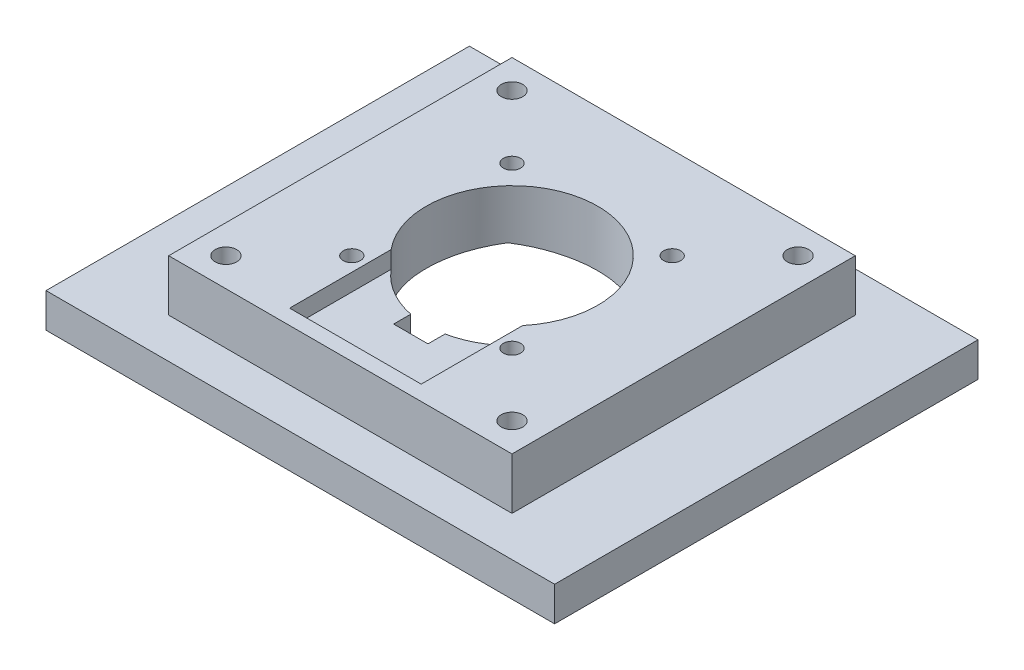
ISO-10303-21;
HEADER;
FILE_DESCRIPTION(('STEP AP214'),'2;1');
FILE_NAME('part.step','',(''),(''),'','','');
FILE_SCHEMA(('AUTOMOTIVE_DESIGN { 1 0 10303 214 1 1 1 1 }'));
ENDSEC;
DATA;
#1=APPLICATION_CONTEXT('core data for automotive mechanical design processes');
#2=APPLICATION_PROTOCOL_DEFINITION('international standard','automotive_design',2000,#1);
#3=PRODUCT_CONTEXT('',#1,'mechanical');
#4=PRODUCT('Part','Part','',(#3));
#5=PRODUCT_RELATED_PRODUCT_CATEGORY('part','',(#4));
#6=PRODUCT_DEFINITION_FORMATION('','',#4);
#7=PRODUCT_DEFINITION_CONTEXT('part definition',#1,'design');
#8=PRODUCT_DEFINITION('design','',#6,#7);
#9=PRODUCT_DEFINITION_SHAPE('','',#8);
#10=(LENGTH_UNIT() NAMED_UNIT(*) SI_UNIT(.MILLI.,.METRE.));
#11=(NAMED_UNIT(*) PLANE_ANGLE_UNIT() SI_UNIT($,.RADIAN.));
#12=(NAMED_UNIT(*) SI_UNIT($,.STERADIAN.) SOLID_ANGLE_UNIT());
#13=UNCERTAINTY_MEASURE_WITH_UNIT(LENGTH_MEASURE(1.E-05),#10,'distance_accuracy_value','');
#14=(GEOMETRIC_REPRESENTATION_CONTEXT(3) GLOBAL_UNCERTAINTY_ASSIGNED_CONTEXT((#13)) GLOBAL_UNIT_ASSIGNED_CONTEXT((#10,
#11,#12)) REPRESENTATION_CONTEXT('',''));
#15=CARTESIAN_POINT('',(0.,0.,0.));
#16=DIRECTION('',(0.,0.,1.));
#17=DIRECTION('',(1.,0.,0.));
#18=AXIS2_PLACEMENT_3D('',#15,#16,#17);
#19=CARTESIAN_POINT('',(30.,15.,30.));
#20=DIRECTION('',(-1.,0.,0.));
#21=DIRECTION('',(0.,0.,1.));
#22=AXIS2_PLACEMENT_3D('',#19,#20,#21);
#23=PLANE('',#22);
#24=DIRECTION('',(0.,-1.,0.));
#25=VECTOR('',#24,1.);
#26=CARTESIAN_POINT('',(30.,15.,30.));
#27=LINE('',#26,#25);
#28=CARTESIAN_POINT('',(30.,15.,30.));
#29=VERTEX_POINT('',#28);
#30=CARTESIAN_POINT('',(30.,6.,30.));
#31=VERTEX_POINT('',#30);
#32=EDGE_CURVE('E382',#29,#31,#27,.T.);
#33=ORIENTED_EDGE('',*,*,#32,.T.);
#34=DIRECTION('',(0.,0.,1.));
#35=VECTOR('',#34,1.);
#36=CARTESIAN_POINT('',(30.,6.,-30.));
#37=LINE('',#36,#35);
#38=CARTESIAN_POINT('',(30.,6.,-30.));
#39=VERTEX_POINT('',#38);
#40=EDGE_CURVE('E340',#39,#31,#37,.T.);
#41=ORIENTED_EDGE('',*,*,#40,.F.);
#42=DIRECTION('',(0.,-1.,0.));
#43=VECTOR('',#42,1.);
#44=CARTESIAN_POINT('',(30.,15.,-30.));
#45=LINE('',#44,#43);
#46=CARTESIAN_POINT('',(30.,15.,-30.));
#47=VERTEX_POINT('',#46);
#48=EDGE_CURVE('E394',#47,#39,#45,.T.);
#49=ORIENTED_EDGE('',*,*,#48,.F.);
#50=DIRECTION('',(0.,0.,-1.));
#51=VECTOR('',#50,1.);
#52=CARTESIAN_POINT('',(30.,15.,30.));
#53=LINE('',#52,#51);
#54=EDGE_CURVE('E368',#29,#47,#53,.T.);
#55=ORIENTED_EDGE('',*,*,#54,.F.);
#56=EDGE_LOOP('',(#33,#41,#49,#55));
#57=FACE_BOUND('',#56,.T.);
#58=ADVANCED_FACE('F47',(#57),#23,.F.);
#59=CARTESIAN_POINT('',(-30.,15.,-30.));
#60=DIRECTION('',(0.,0.,1.));
#61=DIRECTION('',(1.,0.,0.));
#62=AXIS2_PLACEMENT_3D('',#59,#60,#61);
#63=PLANE('',#62);
#64=ORIENTED_EDGE('',*,*,#48,.T.);
#65=DIRECTION('',(1.,0.,0.));
#66=VECTOR('',#65,1.);
#67=CARTESIAN_POINT('',(-30.,6.,-30.));
#68=LINE('',#67,#66);
#69=CARTESIAN_POINT('',(-30.,6.,-30.));
#70=VERTEX_POINT('',#69);
#71=EDGE_CURVE('E326',#70,#39,#68,.T.);
#72=ORIENTED_EDGE('',*,*,#71,.F.);
#73=DIRECTION('',(0.,-1.,0.));
#74=VECTOR('',#73,1.);
#75=CARTESIAN_POINT('',(-30.,15.,-30.));
#76=LINE('',#75,#74);
#77=CARTESIAN_POINT('',(-30.,15.,-30.));
#78=VERTEX_POINT('',#77);
#79=EDGE_CURVE('E390',#78,#70,#76,.T.);
#80=ORIENTED_EDGE('',*,*,#79,.F.);
#81=DIRECTION('',(-1.,0.,0.));
#82=VECTOR('',#81,1.);
#83=CARTESIAN_POINT('',(-30.,15.,-30.));
#84=LINE('',#83,#82);
#85=EDGE_CURVE('E372',#47,#78,#84,.T.);
#86=ORIENTED_EDGE('',*,*,#85,.F.);
#87=EDGE_LOOP('',(#64,#72,#80,#86));
#88=FACE_BOUND('',#87,.T.);
#89=ADVANCED_FACE('F499',(#88),#63,.F.);
#90=CARTESIAN_POINT('',(-30.,15.,30.));
#91=DIRECTION('',(1.,0.,0.));
#92=DIRECTION('',(0.,0.,-1.));
#93=AXIS2_PLACEMENT_3D('',#90,#91,#92);
#94=PLANE('',#93);
#95=ORIENTED_EDGE('',*,*,#79,.T.);
#96=DIRECTION('',(0.,0.,-1.));
#97=VECTOR('',#96,1.);
#98=CARTESIAN_POINT('',(-30.,6.,30.));
#99=LINE('',#98,#97);
#100=CARTESIAN_POINT('',(-30.,6.,30.));
#101=VERTEX_POINT('',#100);
#102=EDGE_CURVE('E346',#101,#70,#99,.T.);
#103=ORIENTED_EDGE('',*,*,#102,.F.);
#104=DIRECTION('',(0.,-1.,0.));
#105=VECTOR('',#104,1.);
#106=CARTESIAN_POINT('',(-30.,15.,30.));
#107=LINE('',#106,#105);
#108=CARTESIAN_POINT('',(-30.,15.,30.));
#109=VERTEX_POINT('',#108);
#110=EDGE_CURVE('E386',#109,#101,#107,.T.);
#111=ORIENTED_EDGE('',*,*,#110,.F.);
#112=DIRECTION('',(0.,0.,1.));
#113=VECTOR('',#112,1.);
#114=CARTESIAN_POINT('',(-30.,15.,30.));
#115=LINE('',#114,#113);
#116=EDGE_CURVE('E376',#78,#109,#115,.T.);
#117=ORIENTED_EDGE('',*,*,#116,.F.);
#118=EDGE_LOOP('',(#95,#103,#111,#117));
#119=FACE_BOUND('',#118,.T.);
#120=ADVANCED_FACE('F504',(#119),#94,.F.);
#121=CARTESIAN_POINT('',(-30.,15.,30.));
#122=DIRECTION('',(0.,0.,-1.));
#123=DIRECTION('',(-1.,0.,0.));
#124=AXIS2_PLACEMENT_3D('',#121,#122,#123);
#125=PLANE('',#124);
#126=ORIENTED_EDGE('',*,*,#110,.T.);
#127=DIRECTION('',(-1.,0.,0.));
#128=VECTOR('',#127,1.);
#129=CARTESIAN_POINT('',(30.,6.,30.));
#130=LINE('',#129,#128);
#131=EDGE_CURVE('E343',#31,#101,#130,.T.);
#132=ORIENTED_EDGE('',*,*,#131,.F.);
#133=ORIENTED_EDGE('',*,*,#32,.F.);
#134=DIRECTION('',(1.,0.,0.));
#135=VECTOR('',#134,1.);
#136=CARTESIAN_POINT('',(-30.,15.,30.));
#137=LINE('',#136,#135);
#138=EDGE_CURVE('E379',#109,#29,#137,.T.);
#139=ORIENTED_EDGE('',*,*,#138,.F.);
#140=EDGE_LOOP('',(#126,#132,#133,#139));
#141=FACE_BOUND('',#140,.T.);
#142=ADVANCED_FACE('F513',(#141),#125,.F.);
#143=CARTESIAN_POINT('',(0.,15.,0.));
#144=DIRECTION('',(0.,-1.,0.));
#145=DIRECTION('',(0.,0.,-1.));
#146=AXIS2_PLACEMENT_3D('',#143,#144,#145);
#147=PLANE('',#146);
#148=CARTESIAN_POINT('',(-25.,15.,25.));
#149=DIRECTION('',(0.,1.,0.));
#150=DIRECTION('',(0.,0.,1.));
#151=AXIS2_PLACEMENT_3D('',#148,#149,#150);
#152=CIRCLE('',#151,1.875);
#153=CARTESIAN_POINT('',(-25.,15.,26.875));
#154=VERTEX_POINT('',#153);
#155=EDGE_CURVE('E210',#154,#154,#152,.T.);
#156=ORIENTED_EDGE('',*,*,#155,.F.);
#157=EDGE_LOOP('',(#156));
#158=FACE_BOUND('',#157,.T.);
#159=CARTESIAN_POINT('',(25.,15.,25.));
#160=DIRECTION('',(0.,1.,0.));
#161=DIRECTION('',(0.,0.,1.));
#162=AXIS2_PLACEMENT_3D('',#159,#160,#161);
#163=CIRCLE('',#162,1.875);
#164=CARTESIAN_POINT('',(25.,15.,26.875));
#165=VERTEX_POINT('',#164);
#166=EDGE_CURVE('E224',#165,#165,#163,.T.);
#167=ORIENTED_EDGE('',*,*,#166,.F.);
#168=EDGE_LOOP('',(#167));
#169=FACE_BOUND('',#168,.T.);
#170=CARTESIAN_POINT('',(25.,15.,-25.));
#171=DIRECTION('',(0.,1.,0.));
#172=DIRECTION('',(0.,0.,1.));
#173=AXIS2_PLACEMENT_3D('',#170,#171,#172);
#174=CIRCLE('',#173,1.875);
#175=CARTESIAN_POINT('',(25.,15.,-23.125));
#176=VERTEX_POINT('',#175);
#177=EDGE_CURVE('E216',#176,#176,#174,.T.);
#178=ORIENTED_EDGE('',*,*,#177,.F.);
#179=EDGE_LOOP('',(#178));
#180=FACE_BOUND('',#179,.T.);
#181=CARTESIAN_POINT('',(-25.,15.,-25.));
#182=DIRECTION('',(0.,1.,0.));
#183=DIRECTION('',(0.,0.,1.));
#184=AXIS2_PLACEMENT_3D('',#181,#182,#183);
#185=CIRCLE('',#184,1.875);
#186=CARTESIAN_POINT('',(-25.,15.,-23.125));
#187=VERTEX_POINT('',#186);
#188=EDGE_CURVE('E215',#187,#187,#185,.T.);
#189=ORIENTED_EDGE('',*,*,#188,.F.);
#190=EDGE_LOOP('',(#189));
#191=FACE_BOUND('',#190,.T.);
#192=CARTESIAN_POINT('',(-14.,15.,14.));
#193=DIRECTION('',(0.,1.,0.));
#194=DIRECTION('',(0.,0.,1.));
#195=AXIS2_PLACEMENT_3D('',#192,#193,#194);
#196=CIRCLE('',#195,1.5);
#197=CARTESIAN_POINT('',(-14.,15.,15.5));
#198=VERTEX_POINT('',#197);
#199=EDGE_CURVE('E273',#198,#198,#196,.T.);
#200=ORIENTED_EDGE('',*,*,#199,.F.);
#201=EDGE_LOOP('',(#200));
#202=FACE_BOUND('',#201,.T.);
#203=CARTESIAN_POINT('',(14.,15.,14.));
#204=DIRECTION('',(0.,1.,0.));
#205=DIRECTION('',(0.,0.,1.));
#206=AXIS2_PLACEMENT_3D('',#203,#204,#205);
#207=CIRCLE('',#206,1.5);
#208=CARTESIAN_POINT('',(14.,15.,15.5));
#209=VERTEX_POINT('',#208);
#210=EDGE_CURVE('E290',#209,#209,#207,.T.);
#211=ORIENTED_EDGE('',*,*,#210,.F.);
#212=EDGE_LOOP('',(#211));
#213=FACE_BOUND('',#212,.T.);
#214=CARTESIAN_POINT('',(14.,15.,-14.));
#215=DIRECTION('',(0.,1.,0.));
#216=DIRECTION('',(0.,0.,1.));
#217=AXIS2_PLACEMENT_3D('',#214,#215,#216);
#218=CIRCLE('',#217,1.5);
#219=CARTESIAN_POINT('',(14.,15.,-12.5));
#220=VERTEX_POINT('',#219);
#221=EDGE_CURVE('E282',#220,#220,#218,.T.);
#222=ORIENTED_EDGE('',*,*,#221,.F.);
#223=EDGE_LOOP('',(#222));
#224=FACE_BOUND('',#223,.T.);
#225=CARTESIAN_POINT('',(-14.,15.,-14.));
#226=DIRECTION('',(0.,1.,0.));
#227=DIRECTION('',(0.,0.,1.));
#228=AXIS2_PLACEMENT_3D('',#225,#226,#227);
#229=CIRCLE('',#228,1.5);
#230=CARTESIAN_POINT('',(-14.,15.,-12.5));
#231=VERTEX_POINT('',#230);
#232=EDGE_CURVE('E281',#231,#231,#229,.T.);
#233=ORIENTED_EDGE('',*,*,#232,.F.);
#234=EDGE_LOOP('',(#233));
#235=FACE_BOUND('',#234,.T.);
#236=DIRECTION('',(1.,0.,0.));
#237=VECTOR('',#236,1.);
#238=CARTESIAN_POINT('',(-11.5,15.,27.3693198578709));
#239=LINE('',#238,#237);
#240=CARTESIAN_POINT('',(-11.5,15.,27.3693198578709));
#241=VERTEX_POINT('',#240);
#242=CARTESIAN_POINT('',(11.5,15.,27.3693198578709));
#243=VERTEX_POINT('',#242);
#244=EDGE_CURVE('E239',#241,#243,#239,.T.);
#245=ORIENTED_EDGE('',*,*,#244,.F.);
#246=DIRECTION('',(0.,0.,1.));
#247=VECTOR('',#246,1.);
#248=CARTESIAN_POINT('',(-11.5,15.,9.63068014212911));
#249=LINE('',#248,#247);
#250=CARTESIAN_POINT('',(-11.5,15.,9.63068014212911));
#251=VERTEX_POINT('',#250);
#252=EDGE_CURVE('E262',#251,#241,#249,.T.);
#253=ORIENTED_EDGE('',*,*,#252,.F.);
#254=CARTESIAN_POINT('',(0.,15.,0.));
#255=DIRECTION('',(0.,1.,0.));
#256=DIRECTION('',(0.,0.,1.));
#257=AXIS2_PLACEMENT_3D('',#254,#255,#256);
#258=CIRCLE('',#257,15.);
#259=CARTESIAN_POINT('',(11.5,15.,9.63068014212911));
#260=VERTEX_POINT('',#259);
#261=EDGE_CURVE('E305',#260,#251,#258,.T.);
#262=ORIENTED_EDGE('',*,*,#261,.F.);
#263=DIRECTION('',(0.,0.,-1.));
#264=VECTOR('',#263,1.);
#265=CARTESIAN_POINT('',(11.5,15.,9.63068014212911));
#266=LINE('',#265,#264);
#267=EDGE_CURVE('E258',#243,#260,#266,.T.);
#268=ORIENTED_EDGE('',*,*,#267,.F.);
#269=EDGE_LOOP('',(#245,#253,#262,#268));
#270=FACE_BOUND('',#269,.T.);
#271=ORIENTED_EDGE('',*,*,#54,.T.);
#272=ORIENTED_EDGE('',*,*,#85,.T.);
#273=ORIENTED_EDGE('',*,*,#116,.T.);
#274=ORIENTED_EDGE('',*,*,#138,.T.);
#275=EDGE_LOOP('',(#271,#272,#273,#274));
#276=FACE_BOUND('',#275,.T.);
#277=ADVANCED_FACE('F443',(#158,#169,#180,#191,#202,#213,#224,#235,#270,#276),#147,.F.);
#278=CARTESIAN_POINT('',(-44.4461231261567,6.,37.));
#279=DIRECTION('',(-1.,0.,0.));
#280=DIRECTION('',(0.,0.,1.));
#281=AXIS2_PLACEMENT_3D('',#278,#279,#280);
#282=PLANE('',#281);
#283=DIRECTION('',(0.,0.,1.));
#284=VECTOR('',#283,1.);
#285=CARTESIAN_POINT('',(-44.4461231261567,0.,0.));
#286=LINE('',#285,#284);
#287=CARTESIAN_POINT('',(-44.4461231261567,0.,37.));
#288=VERTEX_POINT('',#287);
#289=CARTESIAN_POINT('',(-44.4461231261567,0.,-37.));
#290=VERTEX_POINT('',#289);
#291=EDGE_CURVE('E349',#288,#290,#286,.F.);
#292=ORIENTED_EDGE('',*,*,#291,.F.);
#293=DIRECTION('',(0.,-1.,0.));
#294=VECTOR('',#293,1.);
#295=CARTESIAN_POINT('',(-44.4461231261567,6.,37.));
#296=LINE('',#295,#294);
#297=CARTESIAN_POINT('',(-44.4461231261567,6.,37.));
#298=VERTEX_POINT('',#297);
#299=EDGE_CURVE('E373',#298,#288,#296,.T.);
#300=ORIENTED_EDGE('',*,*,#299,.F.);
#301=DIRECTION('',(0.,0.,-1.));
#302=VECTOR('',#301,1.);
#303=CARTESIAN_POINT('',(-44.4461231261567,6.,37.));
#304=LINE('',#303,#302);
#305=CARTESIAN_POINT('',(-44.4461231261567,6.,-37.));
#306=VERTEX_POINT('',#305);
#307=EDGE_CURVE('E350',#298,#306,#304,.T.);
#308=ORIENTED_EDGE('',*,*,#307,.T.);
#309=DIRECTION('',(0.,-1.,0.));
#310=VECTOR('',#309,1.);
#311=CARTESIAN_POINT('',(-44.4461231261567,6.,-37.));
#312=LINE('',#311,#310);
#313=EDGE_CURVE('E367',#306,#290,#312,.T.);
#314=ORIENTED_EDGE('',*,*,#313,.T.);
#315=EDGE_LOOP('',(#292,#300,#308,#314));
#316=FACE_BOUND('',#315,.T.);
#317=ADVANCED_FACE('F471',(#316),#282,.T.);
#318=CARTESIAN_POINT('',(44.4461231261567,6.,37.));
#319=DIRECTION('',(0.,0.,1.));
#320=DIRECTION('',(1.,0.,0.));
#321=AXIS2_PLACEMENT_3D('',#318,#319,#320);
#322=PLANE('',#321);
#323=DIRECTION('',(1.,0.,0.));
#324=VECTOR('',#323,1.);
#325=CARTESIAN_POINT('',(0.,0.,37.));
#326=LINE('',#325,#324);
#327=CARTESIAN_POINT('',(44.4461231261567,0.,37.));
#328=VERTEX_POINT('',#327);
#329=EDGE_CURVE('E355',#328,#288,#326,.F.);
#330=ORIENTED_EDGE('',*,*,#329,.F.);
#331=DIRECTION('',(0.,-1.,0.));
#332=VECTOR('',#331,1.);
#333=CARTESIAN_POINT('',(44.4461231261567,6.,37.));
#334=LINE('',#333,#332);
#335=CARTESIAN_POINT('',(44.4461231261567,6.,37.));
#336=VERTEX_POINT('',#335);
#337=EDGE_CURVE('E399',#336,#328,#334,.T.);
#338=ORIENTED_EDGE('',*,*,#337,.F.);
#339=DIRECTION('',(-1.,0.,0.));
#340=VECTOR('',#339,1.);
#341=CARTESIAN_POINT('',(44.4461231261567,6.,37.));
#342=LINE('',#341,#340);
#343=EDGE_CURVE('E363',#336,#298,#342,.T.);
#344=ORIENTED_EDGE('',*,*,#343,.T.);
#345=ORIENTED_EDGE('',*,*,#299,.T.);
#346=EDGE_LOOP('',(#330,#338,#344,#345));
#347=FACE_BOUND('',#346,.T.);
#348=ADVANCED_FACE('F466',(#347),#322,.T.);
#349=CARTESIAN_POINT('',(44.4461231261567,6.,37.));
#350=DIRECTION('',(1.,0.,0.));
#351=DIRECTION('',(0.,0.,-1.));
#352=AXIS2_PLACEMENT_3D('',#349,#350,#351);
#353=PLANE('',#352);
#354=DIRECTION('',(0.,0.,1.));
#355=VECTOR('',#354,1.);
#356=CARTESIAN_POINT('',(44.4461231261567,0.,0.));
#357=LINE('',#356,#355);
#358=CARTESIAN_POINT('',(44.4461231261567,0.,-37.));
#359=VERTEX_POINT('',#358);
#360=EDGE_CURVE('E415',#359,#328,#357,.T.);
#361=ORIENTED_EDGE('',*,*,#360,.F.);
#362=DIRECTION('',(0.,-1.,0.));
#363=VECTOR('',#362,1.);
#364=CARTESIAN_POINT('',(44.4461231261567,6.,-37.));
#365=LINE('',#364,#363);
#366=CARTESIAN_POINT('',(44.4461231261567,6.,-37.));
#367=VERTEX_POINT('',#366);
#368=EDGE_CURVE('E403',#367,#359,#365,.T.);
#369=ORIENTED_EDGE('',*,*,#368,.F.);
#370=DIRECTION('',(0.,0.,1.));
#371=VECTOR('',#370,1.);
#372=CARTESIAN_POINT('',(44.4461231261567,6.,37.));
#373=LINE('',#372,#371);
#374=EDGE_CURVE('E359',#367,#336,#373,.T.);
#375=ORIENTED_EDGE('',*,*,#374,.T.);
#376=ORIENTED_EDGE('',*,*,#337,.T.);
#377=EDGE_LOOP('',(#361,#369,#375,#376));
#378=FACE_BOUND('',#377,.T.);
#379=ADVANCED_FACE('F483',(#378),#353,.T.);
#380=CARTESIAN_POINT('',(44.4461231261567,6.,-37.));
#381=DIRECTION('',(0.,0.,-1.));
#382=DIRECTION('',(-1.,0.,0.));
#383=AXIS2_PLACEMENT_3D('',#380,#381,#382);
#384=PLANE('',#383);
#385=DIRECTION('',(1.,0.,0.));
#386=VECTOR('',#385,1.);
#387=CARTESIAN_POINT('',(0.,0.,-37.));
#388=LINE('',#387,#386);
#389=EDGE_CURVE('E419',#290,#359,#388,.T.);
#390=ORIENTED_EDGE('',*,*,#389,.F.);
#391=ORIENTED_EDGE('',*,*,#313,.F.);
#392=DIRECTION('',(1.,0.,0.));
#393=VECTOR('',#392,1.);
#394=CARTESIAN_POINT('',(44.4461231261567,6.,-37.));
#395=LINE('',#394,#393);
#396=EDGE_CURVE('E354',#306,#367,#395,.T.);
#397=ORIENTED_EDGE('',*,*,#396,.T.);
#398=ORIENTED_EDGE('',*,*,#368,.T.);
#399=EDGE_LOOP('',(#390,#391,#397,#398));
#400=FACE_BOUND('',#399,.T.);
#401=ADVANCED_FACE('F475',(#400),#384,.T.);
#402=CARTESIAN_POINT('',(0.,6.,0.));
#403=DIRECTION('',(0.,1.,0.));
#404=DIRECTION('',(0.,0.,1.));
#405=AXIS2_PLACEMENT_3D('',#402,#403,#404);
#406=PLANE('',#405);
#407=ORIENTED_EDGE('',*,*,#71,.T.);
#408=ORIENTED_EDGE('',*,*,#40,.T.);
#409=ORIENTED_EDGE('',*,*,#131,.T.);
#410=ORIENTED_EDGE('',*,*,#102,.T.);
#411=EDGE_LOOP('',(#407,#408,#409,#410));
#412=FACE_BOUND('',#411,.T.);
#413=ORIENTED_EDGE('',*,*,#307,.F.);
#414=ORIENTED_EDGE('',*,*,#343,.F.);
#415=ORIENTED_EDGE('',*,*,#374,.F.);
#416=ORIENTED_EDGE('',*,*,#396,.F.);
#417=EDGE_LOOP('',(#413,#414,#415,#416));
#418=FACE_BOUND('',#417,.T.);
#419=ADVANCED_FACE('F486',(#412,#418),#406,.T.);
#420=CARTESIAN_POINT('',(0.,8.31166711993473,-1.97225999456078));
#421=DIRECTION('',(0.,-0.972982875400529,0.230877292467922));
#422=DIRECTION('',(0.,-0.230877292467922,-0.972982875400529));
#423=AXIS2_PLACEMENT_3D('',#420,#421,#422);
#424=PLANE('',#423);
#425=CARTESIAN_POINT('',(0.,8.77966101694915,0.));
#426=DIRECTION('',(0.,-0.972982875400529,0.230877292467922));
#427=DIRECTION('',(0.,0.230877292467922,0.972982875400529));
#428=AXIS2_PLACEMENT_3D('',#425,#426,#427);
#429=ELLIPSE('',#428,15.4165097652158,15.);
#430=CARTESIAN_POINT('',(-10.948403517567,6.34664796789249,-10.2534121353102));
#431=VERTEX_POINT('',#430);
#432=CARTESIAN_POINT('',(10.948403517567,6.34664796789249,-10.2534121353102));
#433=VERTEX_POINT('',#432);
#434=EDGE_CURVE('E318',#431,#433,#429,.T.);
#435=ORIENTED_EDGE('',*,*,#434,.F.);
#436=DIRECTION('',(0.773028550413823,0.146461912510268,0.617232345578987));
#437=VECTOR('',#436,1.);
#438=CARTESIAN_POINT('',(-44.4461231261567,0.,-37.));
#439=LINE('',#438,#437);
#440=EDGE_CURVE('E321',#290,#431,#439,.T.);
#441=ORIENTED_EDGE('',*,*,#440,.F.);
#442=ORIENTED_EDGE('',*,*,#389,.T.);
#443=DIRECTION('',(-0.773028550413823,0.146461912510268,0.617232345578987));
#444=VECTOR('',#443,1.);
#445=CARTESIAN_POINT('',(44.4461231261567,0.,-37.));
#446=LINE('',#445,#444);
#447=EDGE_CURVE('E331',#359,#433,#446,.T.);
#448=ORIENTED_EDGE('',*,*,#447,.T.);
#449=EDGE_LOOP('',(#435,#441,#442,#448));
#450=FACE_BOUND('',#449,.T.);
#451=ADVANCED_FACE('F478',(#450),#424,.T.);
#452=CARTESIAN_POINT('',(1.54019474428657,8.12917495152444,0.));
#453=DIRECTION('',(-0.186153358519673,-0.982520700602204,0.));
#454=DIRECTION('',(0.982520700602204,-0.186153358519673,0.));
#455=AXIS2_PLACEMENT_3D('',#452,#453,#454);
#456=PLANE('',#455);
#457=CARTESIAN_POINT('',(0.,8.42098806472151,0.));
#458=DIRECTION('',(-0.186153358519673,-0.982520700602204,0.));
#459=DIRECTION('',(-0.982520700602204,0.186153358519673,0.));
#460=AXIS2_PLACEMENT_3D('',#457,#458,#459);
#461=ELLIPSE('',#460,15.2668539103616,15.);
#462=CARTESIAN_POINT('',(10.948403517567,6.34664796789249,10.2534121353102));
#463=VERTEX_POINT('',#462);
#464=EDGE_CURVE('E315',#433,#463,#461,.T.);
#465=ORIENTED_EDGE('',*,*,#464,.F.);
#466=ORIENTED_EDGE('',*,*,#447,.F.);
#467=ORIENTED_EDGE('',*,*,#360,.T.);
#468=DIRECTION('',(-0.773028550413823,0.146461912510268,-0.617232345578987));
#469=VECTOR('',#468,1.);
#470=CARTESIAN_POINT('',(44.4461231261567,0.,37.));
#471=LINE('',#470,#469);
#472=EDGE_CURVE('E322',#328,#463,#471,.T.);
#473=ORIENTED_EDGE('',*,*,#472,.T.);
#474=EDGE_LOOP('',(#465,#466,#467,#473));
#475=FACE_BOUND('',#474,.T.);
#476=ADVANCED_FACE('F481',(#475),#456,.T.);
#477=CARTESIAN_POINT('',(-1.54019474428657,8.12917495152444,0.));
#478=DIRECTION('',(0.186153358519673,-0.982520700602204,0.));
#479=DIRECTION('',(0.982520700602204,0.186153358519673,0.));
#480=AXIS2_PLACEMENT_3D('',#477,#478,#479);
#481=PLANE('',#480);
#482=CARTESIAN_POINT('',(0.,8.4209880647215,0.));
#483=DIRECTION('',(0.186153358519673,-0.982520700602204,0.));
#484=DIRECTION('',(0.982520700602204,0.186153358519673,0.));
#485=AXIS2_PLACEMENT_3D('',#482,#483,#484);
#486=ELLIPSE('',#485,15.2668539103616,15.);
#487=CARTESIAN_POINT('',(-10.948403517567,6.34664796789249,10.2534121353102));
#488=VERTEX_POINT('',#487);
#489=EDGE_CURVE('E312',#488,#431,#486,.T.);
#490=ORIENTED_EDGE('',*,*,#489,.F.);
#491=DIRECTION('',(0.773028550413823,0.146461912510268,-0.617232345578987));
#492=VECTOR('',#491,1.);
#493=CARTESIAN_POINT('',(-44.4461231261567,0.,37.));
#494=LINE('',#493,#492);
#495=EDGE_CURVE('E327',#288,#488,#494,.T.);
#496=ORIENTED_EDGE('',*,*,#495,.F.);
#497=ORIENTED_EDGE('',*,*,#291,.T.);
#498=ORIENTED_EDGE('',*,*,#440,.T.);
#499=EDGE_LOOP('',(#490,#496,#497,#498));
#500=FACE_BOUND('',#499,.T.);
#501=ADVANCED_FACE('F463',(#500),#481,.T.);
#502=CARTESIAN_POINT('',(0.,8.31166711993473,1.97225999456078));
#503=DIRECTION('',(0.,-0.972982875400529,-0.230877292467922));
#504=DIRECTION('',(0.,0.230877292467922,-0.972982875400529));
#505=AXIS2_PLACEMENT_3D('',#502,#503,#504);
#506=PLANE('',#505);
#507=DIRECTION('',(0.,-0.230877292467922,0.972982875400529));
#508=VECTOR('',#507,1.);
#509=CARTESIAN_POINT('',(3.,8.31166711993473,1.97225999456078));
#510=LINE('',#509,#508);
#511=CARTESIAN_POINT('',(3.,5.29225189163073,14.6969384566991));
#512=VERTEX_POINT('',#511);
#513=CARTESIAN_POINT('',(3.,4.58330103381193,17.6846599289354));
#514=VERTEX_POINT('',#513);
#515=EDGE_CURVE('E207',#512,#514,#510,.T.);
#516=ORIENTED_EDGE('',*,*,#515,.F.);
#517=CARTESIAN_POINT('',(0.,8.77966101694915,0.));
#518=DIRECTION('',(0.,-0.972982875400529,-0.230877292467922));
#519=DIRECTION('',(0.,0.230877292467922,-0.972982875400529));
#520=AXIS2_PLACEMENT_3D('',#517,#518,#519);
#521=ELLIPSE('',#520,15.4165097652158,15.);
#522=EDGE_CURVE('E425',#463,#512,#521,.T.);
#523=ORIENTED_EDGE('',*,*,#522,.F.);
#524=ORIENTED_EDGE('',*,*,#472,.F.);
#525=ORIENTED_EDGE('',*,*,#329,.T.);
#526=ORIENTED_EDGE('',*,*,#495,.T.);
#527=CARTESIAN_POINT('',(-3.,5.29225189163073,14.6969384566991));
#528=VERTEX_POINT('',#527);
#529=EDGE_CURVE('E398',#528,#488,#521,.T.);
#530=ORIENTED_EDGE('',*,*,#529,.F.);
#531=DIRECTION('',(0.,0.230877292467922,-0.972982875400529));
#532=VECTOR('',#531,1.);
#533=CARTESIAN_POINT('',(-3.,8.31166711993473,1.97225999456078));
#534=LINE('',#533,#532);
#535=CARTESIAN_POINT('',(-3.,4.58330103381193,17.6846599289354));
#536=VERTEX_POINT('',#535);
#537=EDGE_CURVE('E198',#536,#528,#534,.T.);
#538=ORIENTED_EDGE('',*,*,#537,.F.);
#539=DIRECTION('',(-1.,0.,0.));
#540=VECTOR('',#539,1.);
#541=CARTESIAN_POINT('',(0.,4.58330103381193,17.6846599289354));
#542=LINE('',#541,#540);
#543=EDGE_CURVE('E180',#514,#536,#542,.T.);
#544=ORIENTED_EDGE('',*,*,#543,.F.);
#545=EDGE_LOOP('',(#516,#523,#524,#525,#526,#530,#538,#544));
#546=FACE_BOUND('',#545,.T.);
#547=ADVANCED_FACE('F455',(#546),#506,.T.);
#548=CARTESIAN_POINT('',(0.,0.,0.));
#549=DIRECTION('',(0.,1.,0.));
#550=DIRECTION('',(0.,0.,1.));
#551=AXIS2_PLACEMENT_3D('',#548,#549,#550);
#552=CYLINDRICAL_SURFACE('',#551,15.);
#553=ORIENTED_EDGE('',*,*,#522,.T.);
#554=DIRECTION('',(0.,1.,0.));
#555=VECTOR('',#554,1.);
#556=CARTESIAN_POINT('',(3.,0.,14.6969384566991));
#557=LINE('',#556,#555);
#558=CARTESIAN_POINT('',(3.,12.,14.6969384566991));
#559=VERTEX_POINT('',#558);
#560=EDGE_CURVE('E203',#512,#559,#557,.T.);
#561=ORIENTED_EDGE('',*,*,#560,.T.);
#562=CARTESIAN_POINT('',(0.,12.,0.));
#563=DIRECTION('',(0.,1.,0.));
#564=DIRECTION('',(0.,0.,1.));
#565=AXIS2_PLACEMENT_3D('',#562,#563,#564);
#566=CIRCLE('',#565,15.);
#567=CARTESIAN_POINT('',(11.5,12.,9.63068014212911));
#568=VERTEX_POINT('',#567);
#569=EDGE_CURVE('E55',#568,#559,#566,.F.);
#570=ORIENTED_EDGE('',*,*,#569,.F.);
#571=DIRECTION('',(0.,1.,0.));
#572=VECTOR('',#571,1.);
#573=CARTESIAN_POINT('',(11.5,12.,9.63068014212911));
#574=LINE('',#573,#572);
#575=EDGE_CURVE('E265',#568,#260,#574,.T.);
#576=ORIENTED_EDGE('',*,*,#575,.T.);
#577=ORIENTED_EDGE('',*,*,#261,.T.);
#578=DIRECTION('',(0.,1.,0.));
#579=VECTOR('',#578,1.);
#580=CARTESIAN_POINT('',(-11.5,12.,9.63068014212911));
#581=LINE('',#580,#579);
#582=CARTESIAN_POINT('',(-11.5,12.,9.63068014212911));
#583=VERTEX_POINT('',#582);
#584=EDGE_CURVE('E270',#583,#251,#581,.T.);
#585=ORIENTED_EDGE('',*,*,#584,.F.);
#586=CARTESIAN_POINT('',(-3.,12.,14.6969384566991));
#587=VERTEX_POINT('',#586);
#588=EDGE_CURVE('E428',#587,#583,#566,.F.);
#589=ORIENTED_EDGE('',*,*,#588,.F.);
#590=DIRECTION('',(0.,1.,0.));
#591=VECTOR('',#590,1.);
#592=CARTESIAN_POINT('',(-3.,0.,14.6969384566991));
#593=LINE('',#592,#591);
#594=EDGE_CURVE('E61',#587,#528,#593,.F.);
#595=ORIENTED_EDGE('',*,*,#594,.T.);
#596=ORIENTED_EDGE('',*,*,#529,.T.);
#597=ORIENTED_EDGE('',*,*,#489,.T.);
#598=ORIENTED_EDGE('',*,*,#434,.T.);
#599=ORIENTED_EDGE('',*,*,#464,.T.);
#600=EDGE_LOOP('',(#553,#561,#570,#576,#577,#585,#589,#595,#596,#597,#598,#599));
#601=FACE_BOUND('',#600,.T.);
#602=ADVANCED_FACE('F439',(#601),#552,.F.);
#603=CARTESIAN_POINT('',(-14.,9.,-14.));
#604=DIRECTION('',(0.,1.,0.));
#605=DIRECTION('',(0.,0.,1.));
#606=AXIS2_PLACEMENT_3D('',#603,#604,#605);
#607=CYLINDRICAL_SURFACE('',#606,1.5);
#608=CARTESIAN_POINT('',(-14.,9.,-14.));
#609=DIRECTION('',(0.,1.,0.));
#610=DIRECTION('',(0.,0.,1.));
#611=AXIS2_PLACEMENT_3D('',#608,#609,#610);
#612=CIRCLE('',#611,1.5);
#613=CARTESIAN_POINT('',(-14.,9.,-12.5));
#614=VERTEX_POINT('',#613);
#615=EDGE_CURVE('E301',#614,#614,#612,.T.);
#616=ORIENTED_EDGE('',*,*,#615,.F.);
#617=EDGE_LOOP('',(#616));
#618=FACE_BOUND('',#617,.T.);
#619=ORIENTED_EDGE('',*,*,#232,.T.);
#620=EDGE_LOOP('',(#619));
#621=FACE_BOUND('',#620,.T.);
#622=ADVANCED_FACE('F602',(#618,#621),#607,.F.);
#623=CARTESIAN_POINT('',(-14.,9.,-14.));
#624=DIRECTION('',(0.,1.,0.));
#625=DIRECTION('',(0.,0.,1.));
#626=AXIS2_PLACEMENT_3D('',#623,#624,#625);
#627=PLANE('',#626);
#628=ORIENTED_EDGE('',*,*,#615,.T.);
#629=EDGE_LOOP('',(#628));
#630=FACE_BOUND('',#629,.T.);
#631=ADVANCED_FACE('F607',(#630),#627,.T.);
#632=CARTESIAN_POINT('',(14.,9.,-14.));
#633=DIRECTION('',(0.,1.,0.));
#634=DIRECTION('',(0.,0.,1.));
#635=AXIS2_PLACEMENT_3D('',#632,#633,#634);
#636=CYLINDRICAL_SURFACE('',#635,1.5);
#637=CARTESIAN_POINT('',(14.,9.,-14.));
#638=DIRECTION('',(0.,1.,0.));
#639=DIRECTION('',(0.,0.,1.));
#640=AXIS2_PLACEMENT_3D('',#637,#638,#639);
#641=CIRCLE('',#640,1.5);
#642=CARTESIAN_POINT('',(14.,9.,-12.5));
#643=VERTEX_POINT('',#642);
#644=EDGE_CURVE('E277',#643,#643,#641,.T.);
#645=ORIENTED_EDGE('',*,*,#644,.F.);
#646=EDGE_LOOP('',(#645));
#647=FACE_BOUND('',#646,.T.);
#648=ORIENTED_EDGE('',*,*,#221,.T.);
#649=EDGE_LOOP('',(#648));
#650=FACE_BOUND('',#649,.T.);
#651=ADVANCED_FACE('F619',(#647,#650),#636,.F.);
#652=CARTESIAN_POINT('',(14.,9.,-14.));
#653=DIRECTION('',(0.,1.,0.));
#654=DIRECTION('',(0.,0.,1.));
#655=AXIS2_PLACEMENT_3D('',#652,#653,#654);
#656=PLANE('',#655);
#657=ORIENTED_EDGE('',*,*,#644,.T.);
#658=EDGE_LOOP('',(#657));
#659=FACE_BOUND('',#658,.T.);
#660=ADVANCED_FACE('F629',(#659),#656,.T.);
#661=CARTESIAN_POINT('',(14.,9.,14.));
#662=DIRECTION('',(0.,1.,0.));
#663=DIRECTION('',(0.,0.,1.));
#664=AXIS2_PLACEMENT_3D('',#661,#662,#663);
#665=CYLINDRICAL_SURFACE('',#664,1.5);
#666=CARTESIAN_POINT('',(14.,9.,14.));
#667=DIRECTION('',(0.,1.,0.));
#668=DIRECTION('',(0.,0.,1.));
#669=AXIS2_PLACEMENT_3D('',#666,#667,#668);
#670=CIRCLE('',#669,1.5);
#671=CARTESIAN_POINT('',(14.,9.,15.5));
#672=VERTEX_POINT('',#671);
#673=EDGE_CURVE('E286',#672,#672,#670,.T.);
#674=ORIENTED_EDGE('',*,*,#673,.F.);
#675=EDGE_LOOP('',(#674));
#676=FACE_BOUND('',#675,.T.);
#677=ORIENTED_EDGE('',*,*,#210,.T.);
#678=EDGE_LOOP('',(#677));
#679=FACE_BOUND('',#678,.T.);
#680=ADVANCED_FACE('F639',(#676,#679),#665,.F.);
#681=CARTESIAN_POINT('',(14.,9.,14.));
#682=DIRECTION('',(0.,1.,0.));
#683=DIRECTION('',(0.,0.,1.));
#684=AXIS2_PLACEMENT_3D('',#681,#682,#683);
#685=PLANE('',#684);
#686=ORIENTED_EDGE('',*,*,#673,.T.);
#687=EDGE_LOOP('',(#686));
#688=FACE_BOUND('',#687,.T.);
#689=ADVANCED_FACE('F649',(#688),#685,.T.);
#690=CARTESIAN_POINT('',(-14.,9.,14.));
#691=DIRECTION('',(0.,1.,0.));
#692=DIRECTION('',(0.,0.,1.));
#693=AXIS2_PLACEMENT_3D('',#690,#691,#692);
#694=CYLINDRICAL_SURFACE('',#693,1.5);
#695=CARTESIAN_POINT('',(-14.,9.,14.));
#696=DIRECTION('',(0.,1.,0.));
#697=DIRECTION('',(0.,0.,1.));
#698=AXIS2_PLACEMENT_3D('',#695,#696,#697);
#699=CIRCLE('',#698,1.5);
#700=CARTESIAN_POINT('',(-14.,9.,15.5));
#701=VERTEX_POINT('',#700);
#702=EDGE_CURVE('E294',#701,#701,#699,.T.);
#703=ORIENTED_EDGE('',*,*,#702,.F.);
#704=EDGE_LOOP('',(#703));
#705=FACE_BOUND('',#704,.T.);
#706=ORIENTED_EDGE('',*,*,#199,.T.);
#707=EDGE_LOOP('',(#706));
#708=FACE_BOUND('',#707,.T.);
#709=ADVANCED_FACE('F659',(#705,#708),#694,.F.);
#710=CARTESIAN_POINT('',(-14.,9.,14.));
#711=DIRECTION('',(0.,1.,0.));
#712=DIRECTION('',(0.,0.,1.));
#713=AXIS2_PLACEMENT_3D('',#710,#711,#712);
#714=PLANE('',#713);
#715=ORIENTED_EDGE('',*,*,#702,.T.);
#716=EDGE_LOOP('',(#715));
#717=FACE_BOUND('',#716,.T.);
#718=ADVANCED_FACE('F669',(#717),#714,.T.);
#719=CARTESIAN_POINT('',(0.,12.,0.));
#720=DIRECTION('',(0.,1.,0.));
#721=DIRECTION('',(0.,0.,1.));
#722=AXIS2_PLACEMENT_3D('',#719,#720,#721);
#723=PLANE('',#722);
#724=DIRECTION('',(0.,0.,-1.));
#725=VECTOR('',#724,1.);
#726=CARTESIAN_POINT('',(3.,12.,17.6846599289354));
#727=LINE('',#726,#725);
#728=CARTESIAN_POINT('',(3.,12.,17.6846599289354));
#729=VERTEX_POINT('',#728);
#730=EDGE_CURVE('E188',#729,#559,#727,.T.);
#731=ORIENTED_EDGE('',*,*,#730,.F.);
#732=DIRECTION('',(1.,0.,0.));
#733=VECTOR('',#732,1.);
#734=CARTESIAN_POINT('',(-3.,12.,17.6846599289354));
#735=LINE('',#734,#733);
#736=CARTESIAN_POINT('',(-3.,12.,17.6846599289354));
#737=VERTEX_POINT('',#736);
#738=EDGE_CURVE('E177',#737,#729,#735,.T.);
#739=ORIENTED_EDGE('',*,*,#738,.F.);
#740=DIRECTION('',(0.,0.,1.));
#741=VECTOR('',#740,1.);
#742=CARTESIAN_POINT('',(-3.,12.,0.));
#743=LINE('',#742,#741);
#744=EDGE_CURVE('E12',#587,#737,#743,.T.);
#745=ORIENTED_EDGE('',*,*,#744,.F.);
#746=ORIENTED_EDGE('',*,*,#588,.T.);
#747=DIRECTION('',(0.,0.,1.));
#748=VECTOR('',#747,1.);
#749=CARTESIAN_POINT('',(-11.5,12.,9.63068014212911));
#750=LINE('',#749,#748);
#751=CARTESIAN_POINT('',(-11.5,12.,27.3693198578709));
#752=VERTEX_POINT('',#751);
#753=EDGE_CURVE('E261',#583,#752,#750,.T.);
#754=ORIENTED_EDGE('',*,*,#753,.T.);
#755=DIRECTION('',(-1.,0.,0.));
#756=VECTOR('',#755,1.);
#757=CARTESIAN_POINT('',(-11.5,12.,27.3693198578709));
#758=LINE('',#757,#756);
#759=CARTESIAN_POINT('',(11.5,12.,27.3693198578709));
#760=VERTEX_POINT('',#759);
#761=EDGE_CURVE('E251',#760,#752,#758,.T.);
#762=ORIENTED_EDGE('',*,*,#761,.F.);
#763=DIRECTION('',(0.,0.,-1.));
#764=VECTOR('',#763,1.);
#765=CARTESIAN_POINT('',(11.5,12.,9.63068014212911));
#766=LINE('',#765,#764);
#767=EDGE_CURVE('E69',#760,#568,#766,.T.);
#768=ORIENTED_EDGE('',*,*,#767,.T.);
#769=ORIENTED_EDGE('',*,*,#569,.T.);
#770=EDGE_LOOP('',(#731,#739,#745,#746,#754,#762,#768,#769));
#771=FACE_BOUND('',#770,.T.);
#772=ADVANCED_FACE('F187',(#771),#723,.T.);
#773=CARTESIAN_POINT('',(11.5,12.,9.63068014212911));
#774=DIRECTION('',(1.,0.,0.));
#775=DIRECTION('',(0.,0.,-1.));
#776=AXIS2_PLACEMENT_3D('',#773,#774,#775);
#777=PLANE('',#776);
#778=ORIENTED_EDGE('',*,*,#267,.T.);
#779=ORIENTED_EDGE('',*,*,#575,.F.);
#780=ORIENTED_EDGE('',*,*,#767,.F.);
#781=DIRECTION('',(0.,1.,0.));
#782=VECTOR('',#781,1.);
#783=CARTESIAN_POINT('',(11.5,-12.0416305603426,27.3693198578709));
#784=LINE('',#783,#782);
#785=EDGE_CURVE('E247',#760,#243,#784,.T.);
#786=ORIENTED_EDGE('',*,*,#785,.T.);
#787=EDGE_LOOP('',(#778,#779,#780,#786));
#788=FACE_BOUND('',#787,.T.);
#789=ADVANCED_FACE('F449',(#788),#777,.F.);
#790=CARTESIAN_POINT('',(-11.5,12.,9.63068014212911));
#791=DIRECTION('',(-1.,0.,0.));
#792=DIRECTION('',(0.,0.,1.));
#793=AXIS2_PLACEMENT_3D('',#790,#791,#792);
#794=PLANE('',#793);
#795=ORIENTED_EDGE('',*,*,#252,.T.);
#796=DIRECTION('',(0.,1.,0.));
#797=VECTOR('',#796,1.);
#798=CARTESIAN_POINT('',(-11.5,-12.0416305603426,27.3693198578709));
#799=LINE('',#798,#797);
#800=EDGE_CURVE('E246',#752,#241,#799,.T.);
#801=ORIENTED_EDGE('',*,*,#800,.F.);
#802=ORIENTED_EDGE('',*,*,#753,.F.);
#803=ORIENTED_EDGE('',*,*,#584,.T.);
#804=EDGE_LOOP('',(#795,#801,#802,#803));
#805=FACE_BOUND('',#804,.T.);
#806=ADVANCED_FACE('F437',(#805),#794,.F.);
#807=CARTESIAN_POINT('',(-11.5,-12.0416305603426,27.3693198578709));
#808=DIRECTION('',(0.,0.,1.));
#809=DIRECTION('',(1.,0.,0.));
#810=AXIS2_PLACEMENT_3D('',#807,#808,#809);
#811=PLANE('',#810);
#812=ORIENTED_EDGE('',*,*,#761,.T.);
#813=ORIENTED_EDGE('',*,*,#800,.T.);
#814=ORIENTED_EDGE('',*,*,#244,.T.);
#815=ORIENTED_EDGE('',*,*,#785,.F.);
#816=EDGE_LOOP('',(#812,#813,#814,#815));
#817=FACE_BOUND('',#816,.T.);
#818=ADVANCED_FACE('F446',(#817),#811,.F.);
#819=CARTESIAN_POINT('',(-25.,10.,-25.));
#820=DIRECTION('',(0.,1.,0.));
#821=DIRECTION('',(0.,0.,1.));
#822=AXIS2_PLACEMENT_3D('',#819,#820,#821);
#823=CYLINDRICAL_SURFACE('',#822,1.875);
#824=CARTESIAN_POINT('',(-25.,10.,-25.));
#825=DIRECTION('',(0.,1.,0.));
#826=DIRECTION('',(0.,0.,1.));
#827=AXIS2_PLACEMENT_3D('',#824,#825,#826);
#828=CIRCLE('',#827,1.875);
#829=CARTESIAN_POINT('',(-25.,10.,-23.125));
#830=VERTEX_POINT('',#829);
#831=EDGE_CURVE('E235',#830,#830,#828,.T.);
#832=ORIENTED_EDGE('',*,*,#831,.F.);
#833=EDGE_LOOP('',(#832));
#834=FACE_BOUND('',#833,.T.);
#835=ORIENTED_EDGE('',*,*,#188,.T.);
#836=EDGE_LOOP('',(#835));
#837=FACE_BOUND('',#836,.T.);
#838=ADVANCED_FACE('F708',(#834,#837),#823,.F.);
#839=CARTESIAN_POINT('',(-25.,10.,-25.));
#840=DIRECTION('',(0.,1.,0.));
#841=DIRECTION('',(0.,0.,1.));
#842=AXIS2_PLACEMENT_3D('',#839,#840,#841);
#843=PLANE('',#842);
#844=ORIENTED_EDGE('',*,*,#831,.T.);
#845=EDGE_LOOP('',(#844));
#846=FACE_BOUND('',#845,.T.);
#847=ADVANCED_FACE('F721',(#846),#843,.T.);
#848=CARTESIAN_POINT('',(25.,10.,-25.));
#849=DIRECTION('',(0.,1.,0.));
#850=DIRECTION('',(0.,0.,1.));
#851=AXIS2_PLACEMENT_3D('',#848,#849,#850);
#852=CYLINDRICAL_SURFACE('',#851,1.875);
#853=CARTESIAN_POINT('',(25.,10.,-25.));
#854=DIRECTION('',(0.,1.,0.));
#855=DIRECTION('',(0.,0.,1.));
#856=AXIS2_PLACEMENT_3D('',#853,#854,#855);
#857=CIRCLE('',#856,1.875);
#858=CARTESIAN_POINT('',(25.,10.,-23.125));
#859=VERTEX_POINT('',#858);
#860=EDGE_CURVE('E211',#859,#859,#857,.T.);
#861=ORIENTED_EDGE('',*,*,#860,.F.);
#862=EDGE_LOOP('',(#861));
#863=FACE_BOUND('',#862,.T.);
#864=ORIENTED_EDGE('',*,*,#177,.T.);
#865=EDGE_LOOP('',(#864));
#866=FACE_BOUND('',#865,.T.);
#867=ADVANCED_FACE('F731',(#863,#866),#852,.F.);
#868=CARTESIAN_POINT('',(25.,10.,-25.));
#869=DIRECTION('',(0.,1.,0.));
#870=DIRECTION('',(0.,0.,1.));
#871=AXIS2_PLACEMENT_3D('',#868,#869,#870);
#872=PLANE('',#871);
#873=ORIENTED_EDGE('',*,*,#860,.T.);
#874=EDGE_LOOP('',(#873));
#875=FACE_BOUND('',#874,.T.);
#876=ADVANCED_FACE('F741',(#875),#872,.T.);
#877=CARTESIAN_POINT('',(25.,10.,25.));
#878=DIRECTION('',(0.,1.,0.));
#879=DIRECTION('',(0.,0.,1.));
#880=AXIS2_PLACEMENT_3D('',#877,#878,#879);
#881=CYLINDRICAL_SURFACE('',#880,1.875);
#882=CARTESIAN_POINT('',(25.,10.,25.));
#883=DIRECTION('',(0.,1.,0.));
#884=DIRECTION('',(0.,0.,1.));
#885=AXIS2_PLACEMENT_3D('',#882,#883,#884);
#886=CIRCLE('',#885,1.875);
#887=CARTESIAN_POINT('',(25.,10.,26.875));
#888=VERTEX_POINT('',#887);
#889=EDGE_CURVE('E220',#888,#888,#886,.T.);
#890=ORIENTED_EDGE('',*,*,#889,.F.);
#891=EDGE_LOOP('',(#890));
#892=FACE_BOUND('',#891,.T.);
#893=ORIENTED_EDGE('',*,*,#166,.T.);
#894=EDGE_LOOP('',(#893));
#895=FACE_BOUND('',#894,.T.);
#896=ADVANCED_FACE('F751',(#892,#895),#881,.F.);
#897=CARTESIAN_POINT('',(25.,10.,25.));
#898=DIRECTION('',(0.,1.,0.));
#899=DIRECTION('',(0.,0.,1.));
#900=AXIS2_PLACEMENT_3D('',#897,#898,#899);
#901=PLANE('',#900);
#902=ORIENTED_EDGE('',*,*,#889,.T.);
#903=EDGE_LOOP('',(#902));
#904=FACE_BOUND('',#903,.T.);
#905=ADVANCED_FACE('F761',(#904),#901,.T.);
#906=CARTESIAN_POINT('',(-25.,10.,25.));
#907=DIRECTION('',(0.,1.,0.));
#908=DIRECTION('',(0.,0.,1.));
#909=AXIS2_PLACEMENT_3D('',#906,#907,#908);
#910=CYLINDRICAL_SURFACE('',#909,1.875);
#911=CARTESIAN_POINT('',(-25.,10.,25.));
#912=DIRECTION('',(0.,1.,0.));
#913=DIRECTION('',(0.,0.,1.));
#914=AXIS2_PLACEMENT_3D('',#911,#912,#913);
#915=CIRCLE('',#914,1.875);
#916=CARTESIAN_POINT('',(-25.,10.,26.875));
#917=VERTEX_POINT('',#916);
#918=EDGE_CURVE('E228',#917,#917,#915,.T.);
#919=ORIENTED_EDGE('',*,*,#918,.F.);
#920=EDGE_LOOP('',(#919));
#921=FACE_BOUND('',#920,.T.);
#922=ORIENTED_EDGE('',*,*,#155,.T.);
#923=EDGE_LOOP('',(#922));
#924=FACE_BOUND('',#923,.T.);
#925=ADVANCED_FACE('F771',(#921,#924),#910,.F.);
#926=CARTESIAN_POINT('',(-25.,10.,25.));
#927=DIRECTION('',(0.,1.,0.));
#928=DIRECTION('',(0.,0.,1.));
#929=AXIS2_PLACEMENT_3D('',#926,#927,#928);
#930=PLANE('',#929);
#931=ORIENTED_EDGE('',*,*,#918,.T.);
#932=EDGE_LOOP('',(#931));
#933=FACE_BOUND('',#932,.T.);
#934=ADVANCED_FACE('F781',(#933),#930,.T.);
#935=CARTESIAN_POINT('',(3.,0.,17.6846599289354));
#936=DIRECTION('',(1.,0.,0.));
#937=DIRECTION('',(0.,0.,-1.));
#938=AXIS2_PLACEMENT_3D('',#935,#936,#937);
#939=PLANE('',#938);
#940=ORIENTED_EDGE('',*,*,#515,.T.);
#941=DIRECTION('',(0.,1.,0.));
#942=VECTOR('',#941,1.);
#943=CARTESIAN_POINT('',(3.,0.,17.6846599289354));
#944=LINE('',#943,#942);
#945=EDGE_CURVE('E183',#514,#729,#944,.T.);
#946=ORIENTED_EDGE('',*,*,#945,.T.);
#947=ORIENTED_EDGE('',*,*,#730,.T.);
#948=ORIENTED_EDGE('',*,*,#560,.F.);
#949=EDGE_LOOP('',(#940,#946,#947,#948));
#950=FACE_BOUND('',#949,.T.);
#951=ADVANCED_FACE('F453',(#950),#939,.F.);
#952=CARTESIAN_POINT('',(-3.,0.,17.6846599289354));
#953=DIRECTION('',(0.,0.,1.));
#954=DIRECTION('',(1.,0.,0.));
#955=AXIS2_PLACEMENT_3D('',#952,#953,#954);
#956=PLANE('',#955);
#957=ORIENTED_EDGE('',*,*,#543,.T.);
#958=DIRECTION('',(0.,1.,0.));
#959=VECTOR('',#958,1.);
#960=CARTESIAN_POINT('',(-3.,0.,17.6846599289354));
#961=LINE('',#960,#959);
#962=EDGE_CURVE('E173',#536,#737,#961,.T.);
#963=ORIENTED_EDGE('',*,*,#962,.T.);
#964=ORIENTED_EDGE('',*,*,#738,.T.);
#965=ORIENTED_EDGE('',*,*,#945,.F.);
#966=EDGE_LOOP('',(#957,#963,#964,#965));
#967=FACE_BOUND('',#966,.T.);
#968=ADVANCED_FACE('F174',(#967),#956,.F.);
#969=CARTESIAN_POINT('',(-3.,0.,17.6846599289354));
#970=DIRECTION('',(-1.,0.,0.));
#971=DIRECTION('',(0.,0.,1.));
#972=AXIS2_PLACEMENT_3D('',#969,#970,#971);
#973=PLANE('',#972);
#974=ORIENTED_EDGE('',*,*,#537,.T.);
#975=ORIENTED_EDGE('',*,*,#594,.F.);
#976=ORIENTED_EDGE('',*,*,#744,.T.);
#977=ORIENTED_EDGE('',*,*,#962,.F.);
#978=EDGE_LOOP('',(#974,#975,#976,#977));
#979=FACE_BOUND('',#978,.T.);
#980=ADVANCED_FACE('F185',(#979),#973,.F.);
#981=CLOSED_SHELL('',(#58,#89,#120,#142,#277,#317,#348,#379,#401,#419,#451,#476,#501,#547,#602,
#622,#631,#651,#660,#680,#689,#709,#718,#772,#789,#806,#818,#838,#847,#867,#876,#896,#905,#925,
#934,#951,#968,#980));
#982=MANIFOLD_SOLID_BREP('B2',#981);
#983=ADVANCED_BREP_SHAPE_REPRESENTATION('',(#18,#982),#14);
#984=SHAPE_DEFINITION_REPRESENTATION(#9,#983);
ENDSEC;
END-ISO-10303-21;
